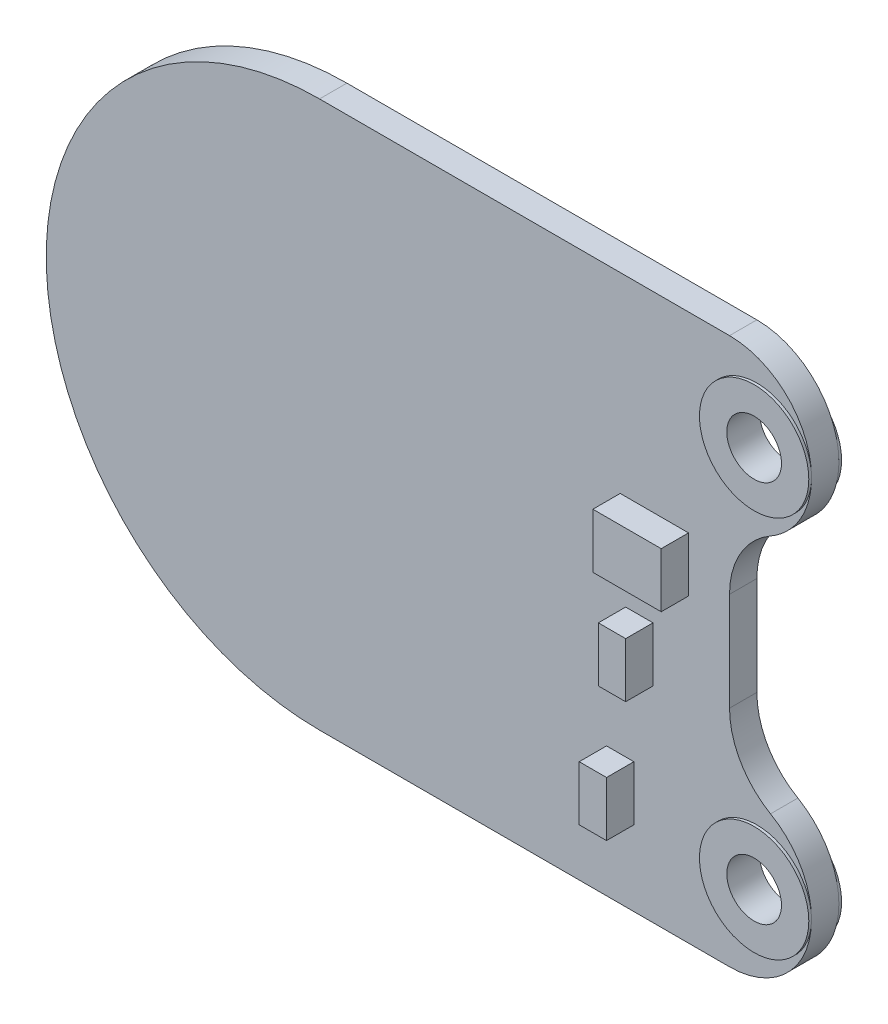
ISO-10303-21;
HEADER;
FILE_DESCRIPTION(('STEP AP214'),'2;1');
FILE_NAME('part.step','',(''),(''),'','','');
FILE_SCHEMA(('AUTOMOTIVE_DESIGN { 1 0 10303 214 1 1 1 1 }'));
ENDSEC;
DATA;
#1=APPLICATION_CONTEXT('core data for automotive mechanical design processes');
#2=APPLICATION_PROTOCOL_DEFINITION('international standard','automotive_design',2000,#1);
#3=PRODUCT_CONTEXT('',#1,'mechanical');
#4=PRODUCT('Part','Part','',(#3));
#5=PRODUCT_RELATED_PRODUCT_CATEGORY('part','',(#4));
#6=PRODUCT_DEFINITION_FORMATION('','',#4);
#7=PRODUCT_DEFINITION_CONTEXT('part definition',#1,'design');
#8=PRODUCT_DEFINITION('design','',#6,#7);
#9=PRODUCT_DEFINITION_SHAPE('','',#8);
#10=(LENGTH_UNIT() NAMED_UNIT(*) SI_UNIT(.MILLI.,.METRE.));
#11=(NAMED_UNIT(*) PLANE_ANGLE_UNIT() SI_UNIT($,.RADIAN.));
#12=(NAMED_UNIT(*) SI_UNIT($,.STERADIAN.) SOLID_ANGLE_UNIT());
#13=UNCERTAINTY_MEASURE_WITH_UNIT(LENGTH_MEASURE(1.E-05),#10,'distance_accuracy_value','');
#14=(GEOMETRIC_REPRESENTATION_CONTEXT(3) GLOBAL_UNCERTAINTY_ASSIGNED_CONTEXT((#13)) GLOBAL_UNIT_ASSIGNED_CONTEXT((#10,
#11,#12)) REPRESENTATION_CONTEXT('',''));
#15=CARTESIAN_POINT('',(0.,0.,0.));
#16=DIRECTION('',(0.,0.,1.));
#17=DIRECTION('',(1.,0.,0.));
#18=AXIS2_PLACEMENT_3D('',#15,#16,#17);
#19=CARTESIAN_POINT('',(11.,7.,1.));
#20=DIRECTION('',(0.,0.,1.));
#21=DIRECTION('',(1.,0.,0.));
#22=AXIS2_PLACEMENT_3D('',#19,#20,#21);
#23=PLANE('',#22);
#24=CARTESIAN_POINT('',(11.,-7.,1.));
#25=DIRECTION('',(0.,0.,1.));
#26=DIRECTION('',(1.,0.,0.));
#27=AXIS2_PLACEMENT_3D('',#24,#25,#26);
#28=CIRCLE('',#27,3.);
#29=CARTESIAN_POINT('',(11.,-10.,1.));
#30=VERTEX_POINT('',#29);
#31=CARTESIAN_POINT('',(14.,-7.,1.));
#32=VERTEX_POINT('',#31);
#33=EDGE_CURVE('E362',#30,#32,#28,.T.);
#34=ORIENTED_EDGE('',*,*,#33,.T.);
#35=CARTESIAN_POINT('',(12.,-7.,1.));
#36=DIRECTION('',(0.,0.,1.));
#37=DIRECTION('',(1.,0.,0.));
#38=AXIS2_PLACEMENT_3D('',#35,#36,#37);
#39=CIRCLE('',#38,2.);
#40=EDGE_CURVE('E327',#32,#32,#39,.T.);
#41=ORIENTED_EDGE('',*,*,#40,.F.);
#42=CARTESIAN_POINT('',(12.5,-4.40192378864668,1.));
#43=VERTEX_POINT('',#42);
#44=EDGE_CURVE('E361',#32,#43,#28,.T.);
#45=ORIENTED_EDGE('',*,*,#44,.T.);
#46=CARTESIAN_POINT('',(14.,-1.80384757729337,1.));
#47=DIRECTION('',(0.,0.,1.));
#48=DIRECTION('',(1.,0.,0.));
#49=AXIS2_PLACEMENT_3D('',#46,#47,#48);
#50=CIRCLE('',#49,3.);
#51=CARTESIAN_POINT('',(11.,-1.80384757729337,1.));
#52=VERTEX_POINT('',#51);
#53=EDGE_CURVE('E426',#43,#52,#50,.F.);
#54=ORIENTED_EDGE('',*,*,#53,.T.);
#55=DIRECTION('',(0.,1.,0.));
#56=VECTOR('',#55,1.);
#57=CARTESIAN_POINT('',(11.,4.,1.));
#58=LINE('',#57,#56);
#59=CARTESIAN_POINT('',(11.,1.80384757729337,1.));
#60=VERTEX_POINT('',#59);
#61=EDGE_CURVE('E365',#52,#60,#58,.T.);
#62=ORIENTED_EDGE('',*,*,#61,.T.);
#63=CARTESIAN_POINT('',(14.,1.80384757729337,1.));
#64=DIRECTION('',(0.,0.,1.));
#65=DIRECTION('',(1.,0.,0.));
#66=AXIS2_PLACEMENT_3D('',#63,#64,#65);
#67=CIRCLE('',#66,3.);
#68=CARTESIAN_POINT('',(12.5,4.40192378864669,1.));
#69=VERTEX_POINT('',#68);
#70=EDGE_CURVE('E11',#60,#69,#67,.F.);
#71=ORIENTED_EDGE('',*,*,#70,.T.);
#72=CARTESIAN_POINT('',(11.,7.,1.));
#73=DIRECTION('',(0.,0.,1.));
#74=DIRECTION('',(1.,0.,0.));
#75=AXIS2_PLACEMENT_3D('',#72,#73,#74);
#76=CIRCLE('',#75,3.);
#77=CARTESIAN_POINT('',(14.,7.,1.));
#78=VERTEX_POINT('',#77);
#79=EDGE_CURVE('E348',#69,#78,#76,.T.);
#80=ORIENTED_EDGE('',*,*,#79,.T.);
#81=CARTESIAN_POINT('',(12.,7.,1.));
#82=DIRECTION('',(0.,0.,1.));
#83=DIRECTION('',(1.,0.,0.));
#84=AXIS2_PLACEMENT_3D('',#81,#82,#83);
#85=CIRCLE('',#84,2.);
#86=EDGE_CURVE('E343',#78,#78,#85,.T.);
#87=ORIENTED_EDGE('',*,*,#86,.F.);
#88=CARTESIAN_POINT('',(11.,10.,1.));
#89=VERTEX_POINT('',#88);
#90=EDGE_CURVE('E352',#78,#89,#76,.T.);
#91=ORIENTED_EDGE('',*,*,#90,.T.);
#92=DIRECTION('',(-1.,0.,0.));
#93=VECTOR('',#92,1.);
#94=CARTESIAN_POINT('',(-4.,10.,1.));
#95=LINE('',#94,#93);
#96=CARTESIAN_POINT('',(-4.,10.,1.));
#97=VERTEX_POINT('',#96);
#98=EDGE_CURVE('E351',#89,#97,#95,.T.);
#99=ORIENTED_EDGE('',*,*,#98,.T.);
#100=CARTESIAN_POINT('',(-4.,0.,1.));
#101=DIRECTION('',(0.,0.,1.));
#102=DIRECTION('',(1.,0.,0.));
#103=AXIS2_PLACEMENT_3D('',#100,#101,#102);
#104=CIRCLE('',#103,10.);
#105=CARTESIAN_POINT('',(-4.,-10.,1.));
#106=VERTEX_POINT('',#105);
#107=EDGE_CURVE('E355',#97,#106,#104,.T.);
#108=ORIENTED_EDGE('',*,*,#107,.T.);
#109=DIRECTION('',(1.,0.,0.));
#110=VECTOR('',#109,1.);
#111=CARTESIAN_POINT('',(-4.,-10.,1.));
#112=LINE('',#111,#110);
#113=EDGE_CURVE('E358',#106,#30,#112,.T.);
#114=ORIENTED_EDGE('',*,*,#113,.T.);
#115=EDGE_LOOP('',(#34,#41,#45,#54,#62,#71,#80,#87,#91,#99,#108,#114));
#116=FACE_BOUND('',#115,.T.);
#117=DIRECTION('',(-1.,0.,0.));
#118=VECTOR('',#117,1.);
#119=CARTESIAN_POINT('',(7.,3.,1.));
#120=LINE('',#119,#118);
#121=CARTESIAN_POINT('',(9.50000000000001,3.,1.));
#122=VERTEX_POINT('',#121);
#123=CARTESIAN_POINT('',(7.,3.,1.));
#124=VERTEX_POINT('',#123);
#125=EDGE_CURVE('E281',#122,#124,#120,.T.);
#126=ORIENTED_EDGE('',*,*,#125,.F.);
#127=DIRECTION('',(0.,1.,0.));
#128=VECTOR('',#127,1.);
#129=CARTESIAN_POINT('',(9.50000000000001,3.,1.));
#130=LINE('',#129,#128);
#131=CARTESIAN_POINT('',(9.50000000000001,1.,1.));
#132=VERTEX_POINT('',#131);
#133=EDGE_CURVE('E262',#132,#122,#130,.T.);
#134=ORIENTED_EDGE('',*,*,#133,.F.);
#135=DIRECTION('',(1.,0.,0.));
#136=VECTOR('',#135,1.);
#137=CARTESIAN_POINT('',(7.,1.,1.));
#138=LINE('',#137,#136);
#139=CARTESIAN_POINT('',(7.,1.,1.));
#140=VERTEX_POINT('',#139);
#141=EDGE_CURVE('E268',#140,#132,#138,.T.);
#142=ORIENTED_EDGE('',*,*,#141,.F.);
#143=DIRECTION('',(0.,-1.,0.));
#144=VECTOR('',#143,1.);
#145=CARTESIAN_POINT('',(7.,3.,1.));
#146=LINE('',#145,#144);
#147=EDGE_CURVE('E284',#124,#140,#146,.T.);
#148=ORIENTED_EDGE('',*,*,#147,.F.);
#149=EDGE_LOOP('',(#126,#134,#142,#148));
#150=FACE_BOUND('',#149,.T.);
#151=DIRECTION('',(-1.,0.,0.));
#152=VECTOR('',#151,1.);
#153=CARTESIAN_POINT('',(7.2,-0.499999999999999,1.));
#154=LINE('',#153,#152);
#155=CARTESIAN_POINT('',(8.2,-0.499999999999999,1.));
#156=VERTEX_POINT('',#155);
#157=CARTESIAN_POINT('',(7.2,-0.499999999999999,1.));
#158=VERTEX_POINT('',#157);
#159=EDGE_CURVE('E223',#156,#158,#154,.T.);
#160=ORIENTED_EDGE('',*,*,#159,.F.);
#161=DIRECTION('',(0.,1.,0.));
#162=VECTOR('',#161,1.);
#163=CARTESIAN_POINT('',(8.2,-0.499999999999999,1.));
#164=LINE('',#163,#162);
#165=CARTESIAN_POINT('',(8.2,-2.5,1.));
#166=VERTEX_POINT('',#165);
#167=EDGE_CURVE('E218',#166,#156,#164,.T.);
#168=ORIENTED_EDGE('',*,*,#167,.F.);
#169=DIRECTION('',(1.,0.,0.));
#170=VECTOR('',#169,1.);
#171=CARTESIAN_POINT('',(7.2,-2.5,1.));
#172=LINE('',#171,#170);
#173=CARTESIAN_POINT('',(7.2,-2.5,1.));
#174=VERTEX_POINT('',#173);
#175=EDGE_CURVE('E233',#174,#166,#172,.T.);
#176=ORIENTED_EDGE('',*,*,#175,.F.);
#177=DIRECTION('',(0.,-1.,0.));
#178=VECTOR('',#177,1.);
#179=CARTESIAN_POINT('',(7.2,-0.499999999999999,1.));
#180=LINE('',#179,#178);
#181=EDGE_CURVE('E245',#158,#174,#180,.T.);
#182=ORIENTED_EDGE('',*,*,#181,.F.);
#183=EDGE_LOOP('',(#160,#168,#176,#182));
#184=FACE_BOUND('',#183,.T.);
#185=DIRECTION('',(-1.,0.,0.));
#186=VECTOR('',#185,1.);
#187=CARTESIAN_POINT('',(6.50000000000001,-5.25,1.));
#188=LINE('',#187,#186);
#189=CARTESIAN_POINT('',(7.50000000000001,-5.25,1.));
#190=VERTEX_POINT('',#189);
#191=CARTESIAN_POINT('',(6.50000000000001,-5.25,1.));
#192=VERTEX_POINT('',#191);
#193=EDGE_CURVE('E801',#190,#192,#188,.T.);
#194=ORIENTED_EDGE('',*,*,#193,.F.);
#195=DIRECTION('',(0.,1.,0.));
#196=VECTOR('',#195,1.);
#197=CARTESIAN_POINT('',(7.50000000000001,-5.25,1.));
#198=LINE('',#197,#196);
#199=CARTESIAN_POINT('',(7.50000000000001,-7.25,1.));
#200=VERTEX_POINT('',#199);
#201=EDGE_CURVE('E215',#200,#190,#198,.T.);
#202=ORIENTED_EDGE('',*,*,#201,.F.);
#203=DIRECTION('',(1.,0.,0.));
#204=VECTOR('',#203,1.);
#205=CARTESIAN_POINT('',(6.50000000000001,-7.25,1.));
#206=LINE('',#205,#204);
#207=CARTESIAN_POINT('',(6.50000000000001,-7.25,1.));
#208=VERTEX_POINT('',#207);
#209=EDGE_CURVE('E211',#208,#200,#206,.T.);
#210=ORIENTED_EDGE('',*,*,#209,.F.);
#211=DIRECTION('',(0.,-1.,0.));
#212=VECTOR('',#211,1.);
#213=CARTESIAN_POINT('',(6.50000000000001,-5.25,1.));
#214=LINE('',#213,#212);
#215=EDGE_CURVE('E797',#192,#208,#214,.T.);
#216=ORIENTED_EDGE('',*,*,#215,.F.);
#217=EDGE_LOOP('',(#194,#202,#210,#216));
#218=FACE_BOUND('',#217,.T.);
#219=ADVANCED_FACE('F39',(#116,#150,#184,#218),#23,.T.);
#220=CARTESIAN_POINT('',(12.,7.,-0.1));
#221=DIRECTION('',(0.,0.,1.));
#222=DIRECTION('',(1.,0.,0.));
#223=AXIS2_PLACEMENT_3D('',#220,#221,#222);
#224=CYLINDRICAL_SURFACE('',#223,2.);
#225=ORIENTED_EDGE('',*,*,#86,.T.);
#226=EDGE_LOOP('',(#225));
#227=FACE_BOUND('',#226,.T.);
#228=CARTESIAN_POINT('',(12.,7.,1.1));
#229=DIRECTION('',(0.,0.,1.));
#230=DIRECTION('',(1.,0.,0.));
#231=AXIS2_PLACEMENT_3D('',#228,#229,#230);
#232=CIRCLE('',#231,2.);
#233=CARTESIAN_POINT('',(14.,7.,1.1));
#234=VERTEX_POINT('',#233);
#235=EDGE_CURVE('E331',#234,#234,#232,.T.);
#236=ORIENTED_EDGE('',*,*,#235,.F.);
#237=EDGE_LOOP('',(#236));
#238=FACE_BOUND('',#237,.T.);
#239=ADVANCED_FACE('F454',(#227,#238),#224,.T.);
#240=CARTESIAN_POINT('',(12.,7.,1.1));
#241=DIRECTION('',(0.,0.,1.));
#242=DIRECTION('',(1.,0.,0.));
#243=AXIS2_PLACEMENT_3D('',#240,#241,#242);
#244=PLANE('',#243);
#245=CARTESIAN_POINT('',(12.,7.,1.1));
#246=DIRECTION('',(0.,0.,1.));
#247=DIRECTION('',(1.,0.,0.));
#248=AXIS2_PLACEMENT_3D('',#245,#246,#247);
#249=CIRCLE('',#248,1.);
#250=CARTESIAN_POINT('',(13.,7.,1.1));
#251=VERTEX_POINT('',#250);
#252=EDGE_CURVE('E304',#251,#251,#249,.T.);
#253=ORIENTED_EDGE('',*,*,#252,.F.);
#254=EDGE_LOOP('',(#253));
#255=FACE_BOUND('',#254,.T.);
#256=ORIENTED_EDGE('',*,*,#235,.T.);
#257=EDGE_LOOP('',(#256));
#258=FACE_BOUND('',#257,.T.);
#259=ADVANCED_FACE('F457',(#255,#258),#244,.T.);
#260=CARTESIAN_POINT('',(11.,7.,0.));
#261=DIRECTION('',(0.,0.,1.));
#262=DIRECTION('',(1.,0.,0.));
#263=AXIS2_PLACEMENT_3D('',#260,#261,#262);
#264=PLANE('',#263);
#265=CARTESIAN_POINT('',(11.,-7.,0.));
#266=DIRECTION('',(0.,0.,1.));
#267=DIRECTION('',(1.,0.,0.));
#268=AXIS2_PLACEMENT_3D('',#265,#266,#267);
#269=CIRCLE('',#268,3.);
#270=CARTESIAN_POINT('',(14.,-7.,0.));
#271=VERTEX_POINT('',#270);
#272=CARTESIAN_POINT('',(12.5,-4.40192378864668,0.));
#273=VERTEX_POINT('',#272);
#274=EDGE_CURVE('E383',#271,#273,#269,.T.);
#275=ORIENTED_EDGE('',*,*,#274,.F.);
#276=CARTESIAN_POINT('',(12.,-7.,0.));
#277=DIRECTION('',(0.,0.,1.));
#278=DIRECTION('',(1.,0.,0.));
#279=AXIS2_PLACEMENT_3D('',#276,#277,#278);
#280=CIRCLE('',#279,2.);
#281=EDGE_CURVE('E323',#271,#271,#280,.T.);
#282=ORIENTED_EDGE('',*,*,#281,.T.);
#283=CARTESIAN_POINT('',(11.,-10.,0.));
#284=VERTEX_POINT('',#283);
#285=EDGE_CURVE('E384',#284,#271,#269,.T.);
#286=ORIENTED_EDGE('',*,*,#285,.F.);
#287=DIRECTION('',(1.,0.,0.));
#288=VECTOR('',#287,1.);
#289=CARTESIAN_POINT('',(-4.,-10.,0.));
#290=LINE('',#289,#288);
#291=CARTESIAN_POINT('',(-4.,-10.,0.));
#292=VERTEX_POINT('',#291);
#293=EDGE_CURVE('E380',#292,#284,#290,.T.);
#294=ORIENTED_EDGE('',*,*,#293,.F.);
#295=CARTESIAN_POINT('',(-4.,0.,0.));
#296=DIRECTION('',(0.,0.,1.));
#297=DIRECTION('',(1.,0.,0.));
#298=AXIS2_PLACEMENT_3D('',#295,#296,#297);
#299=CIRCLE('',#298,10.);
#300=CARTESIAN_POINT('',(-4.,10.,0.));
#301=VERTEX_POINT('',#300);
#302=EDGE_CURVE('E377',#301,#292,#299,.T.);
#303=ORIENTED_EDGE('',*,*,#302,.F.);
#304=DIRECTION('',(-1.,0.,0.));
#305=VECTOR('',#304,1.);
#306=CARTESIAN_POINT('',(-4.,10.,0.));
#307=LINE('',#306,#305);
#308=CARTESIAN_POINT('',(11.,10.,0.));
#309=VERTEX_POINT('',#308);
#310=EDGE_CURVE('E374',#309,#301,#307,.T.);
#311=ORIENTED_EDGE('',*,*,#310,.F.);
#312=CARTESIAN_POINT('',(11.,7.,0.));
#313=DIRECTION('',(0.,0.,1.));
#314=DIRECTION('',(1.,0.,0.));
#315=AXIS2_PLACEMENT_3D('',#312,#313,#314);
#316=CIRCLE('',#315,3.);
#317=CARTESIAN_POINT('',(14.,7.,0.));
#318=VERTEX_POINT('',#317);
#319=EDGE_CURVE('E347',#318,#309,#316,.T.);
#320=ORIENTED_EDGE('',*,*,#319,.F.);
#321=CARTESIAN_POINT('',(12.,7.,0.));
#322=DIRECTION('',(0.,0.,1.));
#323=DIRECTION('',(1.,0.,0.));
#324=AXIS2_PLACEMENT_3D('',#321,#322,#323);
#325=CIRCLE('',#324,2.);
#326=EDGE_CURVE('E339',#318,#318,#325,.T.);
#327=ORIENTED_EDGE('',*,*,#326,.T.);
#328=CARTESIAN_POINT('',(12.5,4.40192378864669,0.));
#329=VERTEX_POINT('',#328);
#330=EDGE_CURVE('E370',#329,#318,#316,.T.);
#331=ORIENTED_EDGE('',*,*,#330,.F.);
#332=CARTESIAN_POINT('',(14.,1.80384757729337,0.));
#333=DIRECTION('',(0.,0.,1.));
#334=DIRECTION('',(1.,0.,0.));
#335=AXIS2_PLACEMENT_3D('',#332,#333,#334);
#336=CIRCLE('',#335,3.);
#337=CARTESIAN_POINT('',(11.,1.80384757729337,0.));
#338=VERTEX_POINT('',#337);
#339=EDGE_CURVE('E49',#329,#338,#336,.T.);
#340=ORIENTED_EDGE('',*,*,#339,.T.);
#341=DIRECTION('',(0.,1.,0.));
#342=VECTOR('',#341,1.);
#343=CARTESIAN_POINT('',(11.,4.,0.));
#344=LINE('',#343,#342);
#345=CARTESIAN_POINT('',(11.,-1.80384757729337,0.));
#346=VERTEX_POINT('',#345);
#347=EDGE_CURVE('E388',#346,#338,#344,.T.);
#348=ORIENTED_EDGE('',*,*,#347,.F.);
#349=CARTESIAN_POINT('',(14.,-1.80384757729337,0.));
#350=DIRECTION('',(0.,0.,1.));
#351=DIRECTION('',(1.,0.,0.));
#352=AXIS2_PLACEMENT_3D('',#349,#350,#351);
#353=CIRCLE('',#352,3.);
#354=EDGE_CURVE('E422',#346,#273,#353,.T.);
#355=ORIENTED_EDGE('',*,*,#354,.T.);
#356=EDGE_LOOP('',(#275,#282,#286,#294,#303,#311,#320,#327,#331,#340,#348,#355));
#357=FACE_BOUND('',#356,.T.);
#358=ADVANCED_FACE('F434',(#357),#264,.F.);
#359=CARTESIAN_POINT('',(11.,7.,1.));
#360=DIRECTION('',(0.,0.,-1.));
#361=DIRECTION('',(-1.,0.,0.));
#362=AXIS2_PLACEMENT_3D('',#359,#360,#361);
#363=CYLINDRICAL_SURFACE('',#362,3.);
#364=ORIENTED_EDGE('',*,*,#330,.T.);
#365=ORIENTED_EDGE('',*,*,#319,.T.);
#366=DIRECTION('',(0.,0.,-1.));
#367=VECTOR('',#366,1.);
#368=CARTESIAN_POINT('',(11.,10.,1.));
#369=LINE('',#368,#367);
#370=EDGE_CURVE('E403',#89,#309,#369,.T.);
#371=ORIENTED_EDGE('',*,*,#370,.F.);
#372=ORIENTED_EDGE('',*,*,#90,.F.);
#373=ORIENTED_EDGE('',*,*,#79,.F.);
#374=DIRECTION('',(0.,0.,-1.));
#375=VECTOR('',#374,1.);
#376=CARTESIAN_POINT('',(12.5,4.40192378864669,1.));
#377=LINE('',#376,#375);
#378=EDGE_CURVE('E418',#69,#329,#377,.T.);
#379=ORIENTED_EDGE('',*,*,#378,.T.);
#380=EDGE_LOOP('',(#364,#365,#371,#372,#373,#379));
#381=FACE_BOUND('',#380,.T.);
#382=ADVANCED_FACE('F449',(#381),#363,.T.);
#383=CARTESIAN_POINT('',(-4.,10.,1.));
#384=DIRECTION('',(0.,-1.,0.));
#385=DIRECTION('',(0.,0.,-1.));
#386=AXIS2_PLACEMENT_3D('',#383,#384,#385);
#387=PLANE('',#386);
#388=ORIENTED_EDGE('',*,*,#310,.T.);
#389=DIRECTION('',(0.,0.,-1.));
#390=VECTOR('',#389,1.);
#391=CARTESIAN_POINT('',(-4.,10.,1.));
#392=LINE('',#391,#390);
#393=EDGE_CURVE('E399',#97,#301,#392,.T.);
#394=ORIENTED_EDGE('',*,*,#393,.F.);
#395=ORIENTED_EDGE('',*,*,#98,.F.);
#396=ORIENTED_EDGE('',*,*,#370,.T.);
#397=EDGE_LOOP('',(#388,#394,#395,#396));
#398=FACE_BOUND('',#397,.T.);
#399=ADVANCED_FACE('F491',(#398),#387,.F.);
#400=CARTESIAN_POINT('',(-4.,0.,1.));
#401=DIRECTION('',(0.,0.,-1.));
#402=DIRECTION('',(-1.,0.,0.));
#403=AXIS2_PLACEMENT_3D('',#400,#401,#402);
#404=CYLINDRICAL_SURFACE('',#403,10.);
#405=ORIENTED_EDGE('',*,*,#302,.T.);
#406=DIRECTION('',(0.,0.,-1.));
#407=VECTOR('',#406,1.);
#408=CARTESIAN_POINT('',(-4.,-10.,1.));
#409=LINE('',#408,#407);
#410=EDGE_CURVE('E395',#106,#292,#409,.T.);
#411=ORIENTED_EDGE('',*,*,#410,.F.);
#412=ORIENTED_EDGE('',*,*,#107,.F.);
#413=ORIENTED_EDGE('',*,*,#393,.T.);
#414=EDGE_LOOP('',(#405,#411,#412,#413));
#415=FACE_BOUND('',#414,.T.);
#416=ADVANCED_FACE('F487',(#415),#404,.T.);
#417=CARTESIAN_POINT('',(-4.,-10.,1.));
#418=DIRECTION('',(0.,1.,0.));
#419=DIRECTION('',(0.,0.,1.));
#420=AXIS2_PLACEMENT_3D('',#417,#418,#419);
#421=PLANE('',#420);
#422=ORIENTED_EDGE('',*,*,#293,.T.);
#423=DIRECTION('',(0.,0.,-1.));
#424=VECTOR('',#423,1.);
#425=CARTESIAN_POINT('',(11.,-10.,1.));
#426=LINE('',#425,#424);
#427=EDGE_CURVE('E369',#30,#284,#426,.T.);
#428=ORIENTED_EDGE('',*,*,#427,.F.);
#429=ORIENTED_EDGE('',*,*,#113,.F.);
#430=ORIENTED_EDGE('',*,*,#410,.T.);
#431=EDGE_LOOP('',(#422,#428,#429,#430));
#432=FACE_BOUND('',#431,.T.);
#433=ADVANCED_FACE('F483',(#432),#421,.F.);
#434=CARTESIAN_POINT('',(11.,-7.,1.));
#435=DIRECTION('',(0.,0.,-1.));
#436=DIRECTION('',(-1.,0.,0.));
#437=AXIS2_PLACEMENT_3D('',#434,#435,#436);
#438=CYLINDRICAL_SURFACE('',#437,3.);
#439=ORIENTED_EDGE('',*,*,#285,.T.);
#440=ORIENTED_EDGE('',*,*,#274,.T.);
#441=DIRECTION('',(0.,0.,-1.));
#442=VECTOR('',#441,1.);
#443=CARTESIAN_POINT('',(12.5,-4.40192378864668,1.));
#444=LINE('',#443,#442);
#445=EDGE_CURVE('E414',#273,#43,#444,.F.);
#446=ORIENTED_EDGE('',*,*,#445,.T.);
#447=ORIENTED_EDGE('',*,*,#44,.F.);
#448=ORIENTED_EDGE('',*,*,#33,.F.);
#449=ORIENTED_EDGE('',*,*,#427,.T.);
#450=EDGE_LOOP('',(#439,#440,#446,#447,#448,#449));
#451=FACE_BOUND('',#450,.T.);
#452=ADVANCED_FACE('F480',(#451),#438,.T.);
#453=CARTESIAN_POINT('',(11.,4.,1.));
#454=DIRECTION('',(-1.,0.,0.));
#455=DIRECTION('',(0.,-1.,0.));
#456=AXIS2_PLACEMENT_3D('',#453,#454,#455);
#457=PLANE('',#456);
#458=ORIENTED_EDGE('',*,*,#61,.F.);
#459=DIRECTION('',(0.,0.,1.));
#460=VECTOR('',#459,1.);
#461=CARTESIAN_POINT('',(11.,-1.80384757729337,0.));
#462=LINE('',#461,#460);
#463=EDGE_CURVE('E410',#52,#346,#462,.F.);
#464=ORIENTED_EDGE('',*,*,#463,.T.);
#465=ORIENTED_EDGE('',*,*,#347,.T.);
#466=DIRECTION('',(0.,0.,1.));
#467=VECTOR('',#466,1.);
#468=CARTESIAN_POINT('',(11.,1.80384757729337,1.));
#469=LINE('',#468,#467);
#470=EDGE_CURVE('E407',#338,#60,#469,.T.);
#471=ORIENTED_EDGE('',*,*,#470,.T.);
#472=EDGE_LOOP('',(#458,#464,#465,#471));
#473=FACE_BOUND('',#472,.T.);
#474=ADVANCED_FACE('F440',(#473),#457,.F.);
#475=CARTESIAN_POINT('',(14.,-1.80384757729337,1.));
#476=DIRECTION('',(0.,0.,-1.));
#477=DIRECTION('',(-1.,0.,0.));
#478=AXIS2_PLACEMENT_3D('',#475,#476,#477);
#479=CYLINDRICAL_SURFACE('',#478,3.);
#480=ORIENTED_EDGE('',*,*,#53,.F.);
#481=ORIENTED_EDGE('',*,*,#445,.F.);
#482=ORIENTED_EDGE('',*,*,#354,.F.);
#483=ORIENTED_EDGE('',*,*,#463,.F.);
#484=EDGE_LOOP('',(#480,#481,#482,#483));
#485=FACE_BOUND('',#484,.T.);
#486=ADVANCED_FACE('F479',(#485),#479,.F.);
#487=CARTESIAN_POINT('',(14.,1.80384757729337,1.));
#488=DIRECTION('',(0.,0.,-1.));
#489=DIRECTION('',(-1.,0.,0.));
#490=AXIS2_PLACEMENT_3D('',#487,#488,#489);
#491=CYLINDRICAL_SURFACE('',#490,3.);
#492=ORIENTED_EDGE('',*,*,#70,.F.);
#493=ORIENTED_EDGE('',*,*,#470,.F.);
#494=ORIENTED_EDGE('',*,*,#339,.F.);
#495=ORIENTED_EDGE('',*,*,#378,.F.);
#496=EDGE_LOOP('',(#492,#493,#494,#495));
#497=FACE_BOUND('',#496,.T.);
#498=ADVANCED_FACE('F41',(#497),#491,.F.);
#499=CARTESIAN_POINT('',(12.,7.,-0.1));
#500=DIRECTION('',(0.,0.,1.));
#501=DIRECTION('',(1.,0.,0.));
#502=AXIS2_PLACEMENT_3D('',#499,#500,#501);
#503=PLANE('',#502);
#504=CARTESIAN_POINT('',(12.,7.,-0.1));
#505=DIRECTION('',(0.,0.,1.));
#506=DIRECTION('',(1.,0.,0.));
#507=AXIS2_PLACEMENT_3D('',#504,#505,#506);
#508=CIRCLE('',#507,1.);
#509=CARTESIAN_POINT('',(13.,7.,-0.1));
#510=VERTEX_POINT('',#509);
#511=EDGE_CURVE('E43',#510,#510,#508,.T.);
#512=ORIENTED_EDGE('',*,*,#511,.T.);
#513=EDGE_LOOP('',(#512));
#514=FACE_BOUND('',#513,.T.);
#515=CARTESIAN_POINT('',(12.,7.,-0.1));
#516=DIRECTION('',(0.,0.,1.));
#517=DIRECTION('',(1.,0.,0.));
#518=AXIS2_PLACEMENT_3D('',#515,#516,#517);
#519=CIRCLE('',#518,2.);
#520=CARTESIAN_POINT('',(14.,7.,-0.1));
#521=VERTEX_POINT('',#520);
#522=EDGE_CURVE('E335',#521,#521,#519,.T.);
#523=ORIENTED_EDGE('',*,*,#522,.F.);
#524=EDGE_LOOP('',(#523));
#525=FACE_BOUND('',#524,.T.);
#526=ADVANCED_FACE('F502',(#514,#525),#503,.F.);
#527=ORIENTED_EDGE('',*,*,#522,.T.);
#528=EDGE_LOOP('',(#527));
#529=FACE_BOUND('',#528,.T.);
#530=ORIENTED_EDGE('',*,*,#326,.F.);
#531=EDGE_LOOP('',(#530));
#532=FACE_BOUND('',#531,.T.);
#533=ADVANCED_FACE('F459',(#529,#532),#224,.T.);
#534=CARTESIAN_POINT('',(12.,-7.,-0.1));
#535=DIRECTION('',(0.,0.,1.));
#536=DIRECTION('',(1.,0.,0.));
#537=AXIS2_PLACEMENT_3D('',#534,#535,#536);
#538=PLANE('',#537);
#539=CARTESIAN_POINT('',(12.,-7.,-0.1));
#540=DIRECTION('',(0.,0.,1.));
#541=DIRECTION('',(1.,0.,0.));
#542=AXIS2_PLACEMENT_3D('',#539,#540,#541);
#543=CIRCLE('',#542,1.);
#544=CARTESIAN_POINT('',(13.,-7.,-0.1));
#545=VERTEX_POINT('',#544);
#546=EDGE_CURVE('E308',#545,#545,#543,.T.);
#547=ORIENTED_EDGE('',*,*,#546,.T.);
#548=EDGE_LOOP('',(#547));
#549=FACE_BOUND('',#548,.T.);
#550=CARTESIAN_POINT('',(12.,-7.,-0.1));
#551=DIRECTION('',(0.,0.,1.));
#552=DIRECTION('',(1.,0.,0.));
#553=AXIS2_PLACEMENT_3D('',#550,#551,#552);
#554=CIRCLE('',#553,2.);
#555=CARTESIAN_POINT('',(14.,-7.,-0.1));
#556=VERTEX_POINT('',#555);
#557=EDGE_CURVE('E315',#556,#556,#554,.T.);
#558=ORIENTED_EDGE('',*,*,#557,.F.);
#559=EDGE_LOOP('',(#558));
#560=FACE_BOUND('',#559,.T.);
#561=ADVANCED_FACE('F541',(#549,#560),#538,.F.);
#562=CARTESIAN_POINT('',(12.,-7.,-0.1));
#563=DIRECTION('',(0.,0.,1.));
#564=DIRECTION('',(1.,0.,0.));
#565=AXIS2_PLACEMENT_3D('',#562,#563,#564);
#566=CYLINDRICAL_SURFACE('',#565,2.);
#567=ORIENTED_EDGE('',*,*,#557,.T.);
#568=EDGE_LOOP('',(#567));
#569=FACE_BOUND('',#568,.T.);
#570=ORIENTED_EDGE('',*,*,#281,.F.);
#571=EDGE_LOOP('',(#570));
#572=FACE_BOUND('',#571,.T.);
#573=ADVANCED_FACE('F539',(#569,#572),#566,.T.);
#574=ORIENTED_EDGE('',*,*,#40,.T.);
#575=EDGE_LOOP('',(#574));
#576=FACE_BOUND('',#575,.T.);
#577=CARTESIAN_POINT('',(12.,-7.,1.1));
#578=DIRECTION('',(0.,0.,1.));
#579=DIRECTION('',(1.,0.,0.));
#580=AXIS2_PLACEMENT_3D('',#577,#578,#579);
#581=CIRCLE('',#580,2.);
#582=CARTESIAN_POINT('',(14.,-7.,1.1));
#583=VERTEX_POINT('',#582);
#584=EDGE_CURVE('E319',#583,#583,#581,.T.);
#585=ORIENTED_EDGE('',*,*,#584,.F.);
#586=EDGE_LOOP('',(#585));
#587=FACE_BOUND('',#586,.T.);
#588=ADVANCED_FACE('F536',(#576,#587),#566,.T.);
#589=CARTESIAN_POINT('',(12.,-7.,1.1));
#590=DIRECTION('',(0.,0.,1.));
#591=DIRECTION('',(1.,0.,0.));
#592=AXIS2_PLACEMENT_3D('',#589,#590,#591);
#593=PLANE('',#592);
#594=CARTESIAN_POINT('',(12.,-7.,1.1));
#595=DIRECTION('',(0.,0.,1.));
#596=DIRECTION('',(1.,0.,0.));
#597=AXIS2_PLACEMENT_3D('',#594,#595,#596);
#598=CIRCLE('',#597,1.);
#599=CARTESIAN_POINT('',(13.,-7.,1.1));
#600=VERTEX_POINT('',#599);
#601=EDGE_CURVE('E303',#600,#600,#598,.T.);
#602=ORIENTED_EDGE('',*,*,#601,.F.);
#603=EDGE_LOOP('',(#602));
#604=FACE_BOUND('',#603,.T.);
#605=ORIENTED_EDGE('',*,*,#584,.T.);
#606=EDGE_LOOP('',(#605));
#607=FACE_BOUND('',#606,.T.);
#608=ADVANCED_FACE('F531',(#604,#607),#593,.T.);
#609=CARTESIAN_POINT('',(12.,-7.,-0.9));
#610=DIRECTION('',(0.,0.,1.));
#611=DIRECTION('',(1.,0.,0.));
#612=AXIS2_PLACEMENT_3D('',#609,#610,#611);
#613=CYLINDRICAL_SURFACE('',#612,1.);
#614=ORIENTED_EDGE('',*,*,#601,.T.);
#615=EDGE_LOOP('',(#614));
#616=FACE_BOUND('',#615,.T.);
#617=ORIENTED_EDGE('',*,*,#546,.F.);
#618=EDGE_LOOP('',(#617));
#619=FACE_BOUND('',#618,.T.);
#620=ADVANCED_FACE('F521',(#616,#619),#613,.F.);
#621=CARTESIAN_POINT('',(12.,7.,-0.9));
#622=DIRECTION('',(0.,0.,1.));
#623=DIRECTION('',(1.,0.,0.));
#624=AXIS2_PLACEMENT_3D('',#621,#622,#623);
#625=CYLINDRICAL_SURFACE('',#624,1.);
#626=ORIENTED_EDGE('',*,*,#252,.T.);
#627=EDGE_LOOP('',(#626));
#628=FACE_BOUND('',#627,.T.);
#629=ORIENTED_EDGE('',*,*,#511,.F.);
#630=EDGE_LOOP('',(#629));
#631=FACE_BOUND('',#630,.T.);
#632=ADVANCED_FACE('F518',(#628,#631),#625,.F.);
#633=CARTESIAN_POINT('',(9.50000000000001,3.,2.));
#634=DIRECTION('',(-1.,0.,0.));
#635=DIRECTION('',(0.,-1.,0.));
#636=AXIS2_PLACEMENT_3D('',#633,#634,#635);
#637=PLANE('',#636);
#638=ORIENTED_EDGE('',*,*,#133,.T.);
#639=DIRECTION('',(0.,0.,-1.));
#640=VECTOR('',#639,1.);
#641=CARTESIAN_POINT('',(9.50000000000001,3.,2.));
#642=LINE('',#641,#640);
#643=CARTESIAN_POINT('',(9.50000000000001,3.,2.));
#644=VERTEX_POINT('',#643);
#645=EDGE_CURVE('E300',#644,#122,#642,.T.);
#646=ORIENTED_EDGE('',*,*,#645,.F.);
#647=DIRECTION('',(0.,1.,0.));
#648=VECTOR('',#647,1.);
#649=CARTESIAN_POINT('',(9.50000000000001,3.,2.));
#650=LINE('',#649,#648);
#651=CARTESIAN_POINT('',(9.50000000000001,1.,2.));
#652=VERTEX_POINT('',#651);
#653=EDGE_CURVE('E263',#652,#644,#650,.T.);
#654=ORIENTED_EDGE('',*,*,#653,.F.);
#655=DIRECTION('',(0.,0.,-1.));
#656=VECTOR('',#655,1.);
#657=CARTESIAN_POINT('',(9.50000000000001,1.,2.));
#658=LINE('',#657,#656);
#659=EDGE_CURVE('E277',#652,#132,#658,.T.);
#660=ORIENTED_EDGE('',*,*,#659,.T.);
#661=EDGE_LOOP('',(#638,#646,#654,#660));
#662=FACE_BOUND('',#661,.T.);
#663=ADVANCED_FACE('F520',(#662),#637,.F.);
#664=CARTESIAN_POINT('',(7.,3.,2.));
#665=DIRECTION('',(0.,-1.,0.));
#666=DIRECTION('',(0.,0.,-1.));
#667=AXIS2_PLACEMENT_3D('',#664,#665,#666);
#668=PLANE('',#667);
#669=ORIENTED_EDGE('',*,*,#125,.T.);
#670=DIRECTION('',(0.,0.,-1.));
#671=VECTOR('',#670,1.);
#672=CARTESIAN_POINT('',(7.,3.,2.));
#673=LINE('',#672,#671);
#674=CARTESIAN_POINT('',(7.,3.,2.));
#675=VERTEX_POINT('',#674);
#676=EDGE_CURVE('E296',#675,#124,#673,.T.);
#677=ORIENTED_EDGE('',*,*,#676,.F.);
#678=DIRECTION('',(-1.,0.,0.));
#679=VECTOR('',#678,1.);
#680=CARTESIAN_POINT('',(7.,3.,2.));
#681=LINE('',#680,#679);
#682=EDGE_CURVE('E267',#644,#675,#681,.T.);
#683=ORIENTED_EDGE('',*,*,#682,.F.);
#684=ORIENTED_EDGE('',*,*,#645,.T.);
#685=EDGE_LOOP('',(#669,#677,#683,#684));
#686=FACE_BOUND('',#685,.T.);
#687=ADVANCED_FACE('F528',(#686),#668,.F.);
#688=CARTESIAN_POINT('',(7.,3.,2.));
#689=DIRECTION('',(1.,0.,0.));
#690=DIRECTION('',(0.,0.,-1.));
#691=AXIS2_PLACEMENT_3D('',#688,#689,#690);
#692=PLANE('',#691);
#693=ORIENTED_EDGE('',*,*,#147,.T.);
#694=DIRECTION('',(0.,0.,-1.));
#695=VECTOR('',#694,1.);
#696=CARTESIAN_POINT('',(7.,1.,2.));
#697=LINE('',#696,#695);
#698=CARTESIAN_POINT('',(7.,1.,2.));
#699=VERTEX_POINT('',#698);
#700=EDGE_CURVE('E293',#699,#140,#697,.T.);
#701=ORIENTED_EDGE('',*,*,#700,.F.);
#702=DIRECTION('',(0.,-1.,0.));
#703=VECTOR('',#702,1.);
#704=CARTESIAN_POINT('',(7.,3.,2.));
#705=LINE('',#704,#703);
#706=EDGE_CURVE('E271',#675,#699,#705,.T.);
#707=ORIENTED_EDGE('',*,*,#706,.F.);
#708=ORIENTED_EDGE('',*,*,#676,.T.);
#709=EDGE_LOOP('',(#693,#701,#707,#708));
#710=FACE_BOUND('',#709,.T.);
#711=ADVANCED_FACE('F667',(#710),#692,.F.);
#712=CARTESIAN_POINT('',(7.,1.,2.));
#713=DIRECTION('',(0.,1.,0.));
#714=DIRECTION('',(0.,0.,1.));
#715=AXIS2_PLACEMENT_3D('',#712,#713,#714);
#716=PLANE('',#715);
#717=ORIENTED_EDGE('',*,*,#141,.T.);
#718=ORIENTED_EDGE('',*,*,#659,.F.);
#719=DIRECTION('',(1.,0.,0.));
#720=VECTOR('',#719,1.);
#721=CARTESIAN_POINT('',(7.,1.,2.));
#722=LINE('',#721,#720);
#723=EDGE_CURVE('E274',#699,#652,#722,.T.);
#724=ORIENTED_EDGE('',*,*,#723,.F.);
#725=ORIENTED_EDGE('',*,*,#700,.T.);
#726=EDGE_LOOP('',(#717,#718,#724,#725));
#727=FACE_BOUND('',#726,.T.);
#728=ADVANCED_FACE('F675',(#727),#716,.F.);
#729=CARTESIAN_POINT('',(0.,0.,2.));
#730=DIRECTION('',(0.,0.,1.));
#731=DIRECTION('',(1.,0.,0.));
#732=AXIS2_PLACEMENT_3D('',#729,#730,#731);
#733=PLANE('',#732);
#734=ORIENTED_EDGE('',*,*,#653,.T.);
#735=ORIENTED_EDGE('',*,*,#682,.T.);
#736=ORIENTED_EDGE('',*,*,#706,.T.);
#737=ORIENTED_EDGE('',*,*,#723,.T.);
#738=EDGE_LOOP('',(#734,#735,#736,#737));
#739=FACE_BOUND('',#738,.T.);
#740=ADVANCED_FACE('F684',(#739),#733,.T.);
#741=CARTESIAN_POINT('',(8.2,-0.499999999999999,2.));
#742=DIRECTION('',(-1.,0.,0.));
#743=DIRECTION('',(0.,0.,1.));
#744=AXIS2_PLACEMENT_3D('',#741,#742,#743);
#745=PLANE('',#744);
#746=ORIENTED_EDGE('',*,*,#167,.T.);
#747=DIRECTION('',(0.,0.,-1.));
#748=VECTOR('',#747,1.);
#749=CARTESIAN_POINT('',(8.2,-0.499999999999999,2.));
#750=LINE('',#749,#748);
#751=CARTESIAN_POINT('',(8.2,-0.499999999999999,2.));
#752=VERTEX_POINT('',#751);
#753=EDGE_CURVE('E259',#752,#156,#750,.T.);
#754=ORIENTED_EDGE('',*,*,#753,.F.);
#755=DIRECTION('',(0.,1.,0.));
#756=VECTOR('',#755,1.);
#757=CARTESIAN_POINT('',(8.2,-0.499999999999999,2.));
#758=LINE('',#757,#756);
#759=CARTESIAN_POINT('',(8.2,-2.5,2.));
#760=VERTEX_POINT('',#759);
#761=EDGE_CURVE('E228',#760,#752,#758,.T.);
#762=ORIENTED_EDGE('',*,*,#761,.F.);
#763=DIRECTION('',(0.,0.,-1.));
#764=VECTOR('',#763,1.);
#765=CARTESIAN_POINT('',(8.2,-2.5,2.));
#766=LINE('',#765,#764);
#767=EDGE_CURVE('E241',#760,#166,#766,.T.);
#768=ORIENTED_EDGE('',*,*,#767,.T.);
#769=EDGE_LOOP('',(#746,#754,#762,#768));
#770=FACE_BOUND('',#769,.T.);
#771=ADVANCED_FACE('F693',(#770),#745,.F.);
#772=CARTESIAN_POINT('',(7.2,-0.499999999999999,2.));
#773=DIRECTION('',(0.,-1.,0.));
#774=DIRECTION('',(0.,0.,-1.));
#775=AXIS2_PLACEMENT_3D('',#772,#773,#774);
#776=PLANE('',#775);
#777=ORIENTED_EDGE('',*,*,#159,.T.);
#778=DIRECTION('',(0.,0.,-1.));
#779=VECTOR('',#778,1.);
#780=CARTESIAN_POINT('',(7.2,-0.499999999999999,2.));
#781=LINE('',#780,#779);
#782=CARTESIAN_POINT('',(7.2,-0.499999999999999,2.));
#783=VERTEX_POINT('',#782);
#784=EDGE_CURVE('E255',#783,#158,#781,.T.);
#785=ORIENTED_EDGE('',*,*,#784,.F.);
#786=DIRECTION('',(-1.,0.,0.));
#787=VECTOR('',#786,1.);
#788=CARTESIAN_POINT('',(7.2,-0.499999999999999,2.));
#789=LINE('',#788,#787);
#790=EDGE_CURVE('E232',#752,#783,#789,.T.);
#791=ORIENTED_EDGE('',*,*,#790,.F.);
#792=ORIENTED_EDGE('',*,*,#753,.T.);
#793=EDGE_LOOP('',(#777,#785,#791,#792));
#794=FACE_BOUND('',#793,.T.);
#795=ADVANCED_FACE('F702',(#794),#776,.F.);
#796=CARTESIAN_POINT('',(7.2,-0.499999999999999,2.));
#797=DIRECTION('',(1.,0.,0.));
#798=DIRECTION('',(0.,0.,-1.));
#799=AXIS2_PLACEMENT_3D('',#796,#797,#798);
#800=PLANE('',#799);
#801=ORIENTED_EDGE('',*,*,#181,.T.);
#802=DIRECTION('',(0.,0.,-1.));
#803=VECTOR('',#802,1.);
#804=CARTESIAN_POINT('',(7.2,-2.5,2.));
#805=LINE('',#804,#803);
#806=CARTESIAN_POINT('',(7.2,-2.5,2.));
#807=VERTEX_POINT('',#806);
#808=EDGE_CURVE('E64',#807,#174,#805,.T.);
#809=ORIENTED_EDGE('',*,*,#808,.F.);
#810=DIRECTION('',(0.,-1.,0.));
#811=VECTOR('',#810,1.);
#812=CARTESIAN_POINT('',(7.2,-0.499999999999999,2.));
#813=LINE('',#812,#811);
#814=EDGE_CURVE('E236',#783,#807,#813,.T.);
#815=ORIENTED_EDGE('',*,*,#814,.F.);
#816=ORIENTED_EDGE('',*,*,#784,.T.);
#817=EDGE_LOOP('',(#801,#809,#815,#816));
#818=FACE_BOUND('',#817,.T.);
#819=ADVANCED_FACE('F711',(#818),#800,.F.);
#820=CARTESIAN_POINT('',(7.2,-2.5,2.));
#821=DIRECTION('',(0.,1.,0.));
#822=DIRECTION('',(0.,0.,1.));
#823=AXIS2_PLACEMENT_3D('',#820,#821,#822);
#824=PLANE('',#823);
#825=ORIENTED_EDGE('',*,*,#175,.T.);
#826=ORIENTED_EDGE('',*,*,#767,.F.);
#827=DIRECTION('',(1.,0.,0.));
#828=VECTOR('',#827,1.);
#829=CARTESIAN_POINT('',(7.2,-2.5,2.));
#830=LINE('',#829,#828);
#831=EDGE_CURVE('E239',#807,#760,#830,.T.);
#832=ORIENTED_EDGE('',*,*,#831,.F.);
#833=ORIENTED_EDGE('',*,*,#808,.T.);
#834=EDGE_LOOP('',(#825,#826,#832,#833));
#835=FACE_BOUND('',#834,.T.);
#836=ADVANCED_FACE('F720',(#835),#824,.F.);
#837=CARTESIAN_POINT('',(0.,0.,2.));
#838=DIRECTION('',(0.,0.,1.));
#839=DIRECTION('',(1.,0.,0.));
#840=AXIS2_PLACEMENT_3D('',#837,#838,#839);
#841=PLANE('',#840);
#842=ORIENTED_EDGE('',*,*,#761,.T.);
#843=ORIENTED_EDGE('',*,*,#790,.T.);
#844=ORIENTED_EDGE('',*,*,#814,.T.);
#845=ORIENTED_EDGE('',*,*,#831,.T.);
#846=EDGE_LOOP('',(#842,#843,#844,#845));
#847=FACE_BOUND('',#846,.T.);
#848=ADVANCED_FACE('F729',(#847),#841,.T.);
#849=CARTESIAN_POINT('',(7.50000000000001,-5.25,2.));
#850=DIRECTION('',(-1.,0.,0.));
#851=DIRECTION('',(0.,0.,1.));
#852=AXIS2_PLACEMENT_3D('',#849,#850,#851);
#853=PLANE('',#852);
#854=ORIENTED_EDGE('',*,*,#201,.T.);
#855=DIRECTION('',(0.,0.,-1.));
#856=VECTOR('',#855,1.);
#857=CARTESIAN_POINT('',(7.50000000000001,-5.25,2.));
#858=LINE('',#857,#856);
#859=CARTESIAN_POINT('',(7.50000000000001,-5.25,2.));
#860=VERTEX_POINT('',#859);
#861=EDGE_CURVE('E194',#860,#190,#858,.T.);
#862=ORIENTED_EDGE('',*,*,#861,.F.);
#863=DIRECTION('',(0.,1.,0.));
#864=VECTOR('',#863,1.);
#865=CARTESIAN_POINT('',(7.50000000000001,-5.25,2.));
#866=LINE('',#865,#864);
#867=CARTESIAN_POINT('',(7.50000000000001,-7.25,2.));
#868=VERTEX_POINT('',#867);
#869=EDGE_CURVE('E202',#868,#860,#866,.T.);
#870=ORIENTED_EDGE('',*,*,#869,.F.);
#871=DIRECTION('',(0.,0.,-1.));
#872=VECTOR('',#871,1.);
#873=CARTESIAN_POINT('',(7.50000000000001,-7.25,2.));
#874=LINE('',#873,#872);
#875=EDGE_CURVE('E793',#868,#200,#874,.T.);
#876=ORIENTED_EDGE('',*,*,#875,.T.);
#877=EDGE_LOOP('',(#854,#862,#870,#876));
#878=FACE_BOUND('',#877,.T.);
#879=ADVANCED_FACE('F213',(#878),#853,.F.);
#880=CARTESIAN_POINT('',(6.50000000000001,-5.25,2.));
#881=DIRECTION('',(0.,-1.,0.));
#882=DIRECTION('',(0.,0.,-1.));
#883=AXIS2_PLACEMENT_3D('',#880,#881,#882);
#884=PLANE('',#883);
#885=ORIENTED_EDGE('',*,*,#193,.T.);
#886=DIRECTION('',(0.,0.,-1.));
#887=VECTOR('',#886,1.);
#888=CARTESIAN_POINT('',(6.50000000000001,-5.25,2.));
#889=LINE('',#888,#887);
#890=CARTESIAN_POINT('',(6.50000000000001,-5.25,2.));
#891=VERTEX_POINT('',#890);
#892=EDGE_CURVE('E197',#891,#192,#889,.T.);
#893=ORIENTED_EDGE('',*,*,#892,.F.);
#894=DIRECTION('',(-1.,0.,0.));
#895=VECTOR('',#894,1.);
#896=CARTESIAN_POINT('',(6.50000000000001,-5.25,2.));
#897=LINE('',#896,#895);
#898=EDGE_CURVE('E190',#860,#891,#897,.T.);
#899=ORIENTED_EDGE('',*,*,#898,.F.);
#900=ORIENTED_EDGE('',*,*,#861,.T.);
#901=EDGE_LOOP('',(#885,#893,#899,#900));
#902=FACE_BOUND('',#901,.T.);
#903=ADVANCED_FACE('F192',(#902),#884,.F.);
#904=CARTESIAN_POINT('',(6.50000000000001,-5.25,2.));
#905=DIRECTION('',(1.,0.,0.));
#906=DIRECTION('',(0.,1.,0.));
#907=AXIS2_PLACEMENT_3D('',#904,#905,#906);
#908=PLANE('',#907);
#909=ORIENTED_EDGE('',*,*,#215,.T.);
#910=DIRECTION('',(0.,0.,-1.));
#911=VECTOR('',#910,1.);
#912=CARTESIAN_POINT('',(6.50000000000001,-7.25,2.));
#913=LINE('',#912,#911);
#914=CARTESIAN_POINT('',(6.50000000000001,-7.25,2.));
#915=VERTEX_POINT('',#914);
#916=EDGE_CURVE('E56',#915,#208,#913,.T.);
#917=ORIENTED_EDGE('',*,*,#916,.F.);
#918=DIRECTION('',(0.,-1.,0.));
#919=VECTOR('',#918,1.);
#920=CARTESIAN_POINT('',(6.50000000000001,-5.25,2.));
#921=LINE('',#920,#919);
#922=EDGE_CURVE('E201',#891,#915,#921,.T.);
#923=ORIENTED_EDGE('',*,*,#922,.F.);
#924=ORIENTED_EDGE('',*,*,#892,.T.);
#925=EDGE_LOOP('',(#909,#917,#923,#924));
#926=FACE_BOUND('',#925,.T.);
#927=ADVANCED_FACE('F752',(#926),#908,.F.);
#928=CARTESIAN_POINT('',(6.50000000000001,-7.25,2.));
#929=DIRECTION('',(0.,1.,0.));
#930=DIRECTION('',(0.,0.,1.));
#931=AXIS2_PLACEMENT_3D('',#928,#929,#930);
#932=PLANE('',#931);
#933=ORIENTED_EDGE('',*,*,#209,.T.);
#934=ORIENTED_EDGE('',*,*,#875,.F.);
#935=DIRECTION('',(1.,0.,0.));
#936=VECTOR('',#935,1.);
#937=CARTESIAN_POINT('',(6.50000000000001,-7.25,2.));
#938=LINE('',#937,#936);
#939=EDGE_CURVE('E206',#915,#868,#938,.T.);
#940=ORIENTED_EDGE('',*,*,#939,.F.);
#941=ORIENTED_EDGE('',*,*,#916,.T.);
#942=EDGE_LOOP('',(#933,#934,#940,#941));
#943=FACE_BOUND('',#942,.T.);
#944=ADVANCED_FACE('F760',(#943),#932,.F.);
#945=CARTESIAN_POINT('',(0.,0.,2.));
#946=DIRECTION('',(0.,0.,1.));
#947=DIRECTION('',(1.,0.,0.));
#948=AXIS2_PLACEMENT_3D('',#945,#946,#947);
#949=PLANE('',#948);
#950=ORIENTED_EDGE('',*,*,#869,.T.);
#951=ORIENTED_EDGE('',*,*,#898,.T.);
#952=ORIENTED_EDGE('',*,*,#922,.T.);
#953=ORIENTED_EDGE('',*,*,#939,.T.);
#954=EDGE_LOOP('',(#950,#951,#952,#953));
#955=FACE_BOUND('',#954,.T.);
#956=ADVANCED_FACE('F205',(#955),#949,.T.);
#957=CLOSED_SHELL('',(#219,#239,#259,#358,#382,#399,#416,#433,#452,#474,#486,#498,#526,#533,
#561,#573,#588,#608,#620,#632,#663,#687,#711,#728,#740,#771,#795,#819,#836,#848,#879,#903,#927,
#944,#956));
#958=MANIFOLD_SOLID_BREP('B2',#957);
#959=ADVANCED_BREP_SHAPE_REPRESENTATION('',(#18,#958),#14);
#960=SHAPE_DEFINITION_REPRESENTATION(#9,#959);
ENDSEC;
END-ISO-10303-21;
